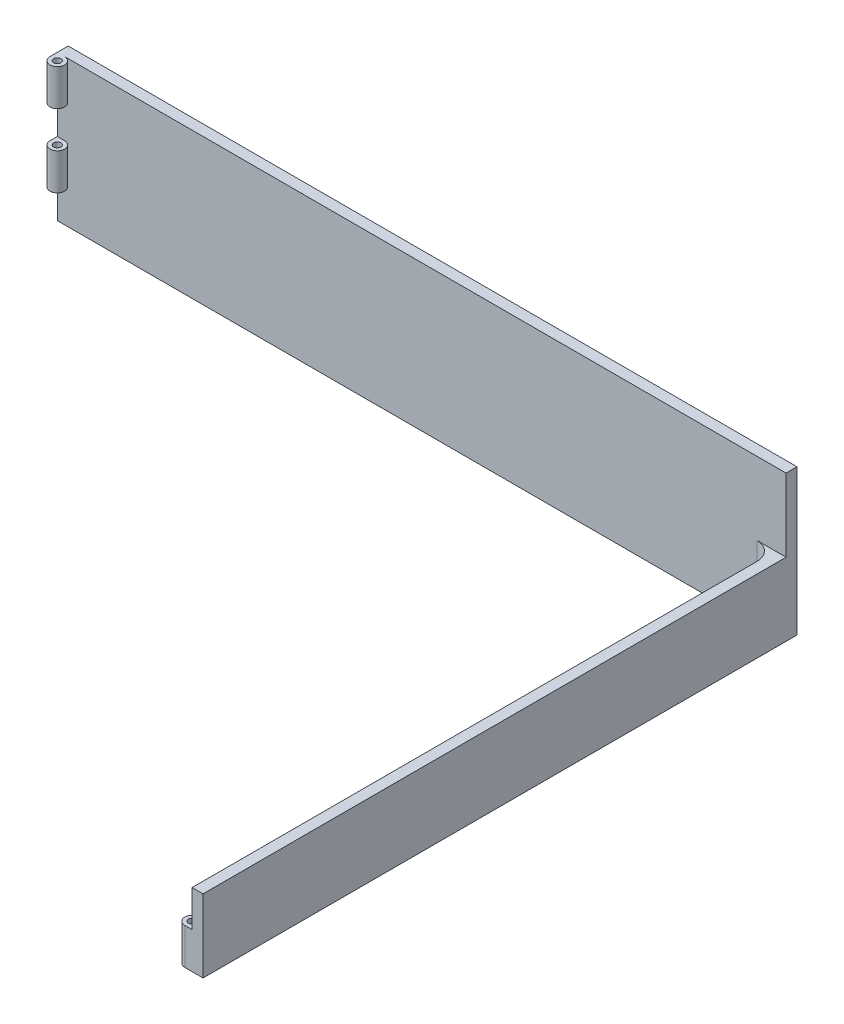
ISO-10303-21;
HEADER;
FILE_DESCRIPTION(('STEP AP214'),'2;1');
FILE_NAME('part.step','',(''),(''),'','','');
FILE_SCHEMA(('AUTOMOTIVE_DESIGN { 1 0 10303 214 1 1 1 1 }'));
ENDSEC;
DATA;
#1=APPLICATION_CONTEXT('core data for automotive mechanical design processes');
#2=APPLICATION_PROTOCOL_DEFINITION('international standard','automotive_design',2000,#1);
#3=PRODUCT_CONTEXT('',#1,'mechanical');
#4=PRODUCT('Part','Part','',(#3));
#5=PRODUCT_RELATED_PRODUCT_CATEGORY('part','',(#4));
#6=PRODUCT_DEFINITION_FORMATION('','',#4);
#7=PRODUCT_DEFINITION_CONTEXT('part definition',#1,'design');
#8=PRODUCT_DEFINITION('design','',#6,#7);
#9=PRODUCT_DEFINITION_SHAPE('','',#8);
#10=(LENGTH_UNIT() NAMED_UNIT(*) SI_UNIT(.MILLI.,.METRE.));
#11=(NAMED_UNIT(*) PLANE_ANGLE_UNIT() SI_UNIT($,.RADIAN.));
#12=(NAMED_UNIT(*) SI_UNIT($,.STERADIAN.) SOLID_ANGLE_UNIT());
#13=UNCERTAINTY_MEASURE_WITH_UNIT(LENGTH_MEASURE(1.E-05),#10,'distance_accuracy_value','');
#14=(GEOMETRIC_REPRESENTATION_CONTEXT(3) GLOBAL_UNCERTAINTY_ASSIGNED_CONTEXT((#13)) GLOBAL_UNIT_ASSIGNED_CONTEXT((#10,
#11,#12)) REPRESENTATION_CONTEXT('',''));
#15=CARTESIAN_POINT('',(0.,0.,0.));
#16=DIRECTION('',(0.,0.,1.));
#17=DIRECTION('',(1.,0.,0.));
#18=AXIS2_PLACEMENT_3D('',#15,#16,#17);
#19=CARTESIAN_POINT('',(43.594982078853,0.,0.));
#20=DIRECTION('',(1.,0.,0.));
#21=DIRECTION('',(0.,1.,0.));
#22=AXIS2_PLACEMENT_3D('',#19,#20,#21);
#23=PLANE('',#22);
#24=DIRECTION('',(0.,-1.,0.));
#25=VECTOR('',#24,1.);
#26=CARTESIAN_POINT('',(43.5949820788531,-23.5125448028674,161.));
#27=LINE('',#26,#25);
#28=CARTESIAN_POINT('',(43.5949820788531,-23.5125448028674,161.));
#29=VERTEX_POINT('',#28);
#30=CARTESIAN_POINT('',(43.5949820788531,-33.5125448028674,161.));
#31=VERTEX_POINT('',#30);
#32=EDGE_CURVE('E156',#29,#31,#27,.T.);
#33=ORIENTED_EDGE('',*,*,#32,.F.);
#34=DIRECTION('',(0.,0.,1.));
#35=VECTOR('',#34,1.);
#36=CARTESIAN_POINT('',(43.5949820788531,-23.5125448028674,163.));
#37=LINE('',#36,#35);
#38=CARTESIAN_POINT('',(43.5949820788531,-23.5125448028674,163.));
#39=VERTEX_POINT('',#38);
#40=EDGE_CURVE('E143',#29,#39,#37,.T.);
#41=ORIENTED_EDGE('',*,*,#40,.T.);
#42=DIRECTION('',(0.,-1.,0.));
#43=VECTOR('',#42,1.);
#44=CARTESIAN_POINT('',(43.594982078853,-13.5125448028674,163.));
#45=LINE('',#44,#43);
#46=CARTESIAN_POINT('',(43.594982078853,-13.5125448028674,163.));
#47=VERTEX_POINT('',#46);
#48=EDGE_CURVE('E154',#47,#39,#45,.T.);
#49=ORIENTED_EDGE('',*,*,#48,.F.);
#50=DIRECTION('',(0.,0.,1.));
#51=VECTOR('',#50,1.);
#52=CARTESIAN_POINT('',(43.594982078853,-13.5125448028674,3.));
#53=LINE('',#52,#51);
#54=CARTESIAN_POINT('',(43.594982078853,-13.5125448028674,8.));
#55=VERTEX_POINT('',#54);
#56=EDGE_CURVE('E163',#55,#47,#53,.T.);
#57=ORIENTED_EDGE('',*,*,#56,.F.);
#58=DIRECTION('',(0.,1.,0.));
#59=VECTOR('',#58,1.);
#60=CARTESIAN_POINT('',(43.594982078853,0.,8.));
#61=LINE('',#60,#59);
#62=CARTESIAN_POINT('',(43.5949820788531,-33.5125448028674,8.00000000000001));
#63=VERTEX_POINT('',#62);
#64=EDGE_CURVE('E217',#55,#63,#61,.F.);
#65=ORIENTED_EDGE('',*,*,#64,.T.);
#66=DIRECTION('',(0.,0.,-1.));
#67=VECTOR('',#66,1.);
#68=CARTESIAN_POINT('',(43.5949820788531,-33.5125448028674,163.));
#69=LINE('',#68,#67);
#70=EDGE_CURVE('E162',#31,#63,#69,.T.);
#71=ORIENTED_EDGE('',*,*,#70,.F.);
#72=EDGE_LOOP('',(#33,#41,#49,#57,#65,#71));
#73=FACE_BOUND('',#72,.T.);
#74=ADVANCED_FACE('F33',(#73),#23,.F.);
#75=CARTESIAN_POINT('',(0.,0.,3.));
#76=DIRECTION('',(0.,0.,1.));
#77=DIRECTION('',(1.,0.,0.));
#78=AXIS2_PLACEMENT_3D('',#75,#76,#77);
#79=PLANE('',#78);
#80=DIRECTION('',(0.,1.,0.));
#81=VECTOR('',#80,1.);
#82=CARTESIAN_POINT('',(-151.405017921147,-23.5125448028674,3.));
#83=LINE('',#82,#81);
#84=CARTESIAN_POINT('',(-151.405017921147,-23.5125448028674,3.));
#85=VERTEX_POINT('',#84);
#86=CARTESIAN_POINT('',(-151.405017921147,-13.5125448028674,3.));
#87=VERTEX_POINT('',#86);
#88=EDGE_CURVE('E56',#85,#87,#83,.T.);
#89=ORIENTED_EDGE('',*,*,#88,.F.);
#90=DIRECTION('',(-1.,0.,0.));
#91=VECTOR('',#90,1.);
#92=CARTESIAN_POINT('',(-153.405017921147,-23.5125448028674,3.));
#93=LINE('',#92,#91);
#94=CARTESIAN_POINT('',(-153.405017921147,-23.5125448028674,3.));
#95=VERTEX_POINT('',#94);
#96=EDGE_CURVE('E231',#85,#95,#93,.T.);
#97=ORIENTED_EDGE('',*,*,#96,.T.);
#98=DIRECTION('',(0.,-1.,0.));
#99=VECTOR('',#98,1.);
#100=CARTESIAN_POINT('',(-153.405017921147,6.48745519713262,3.));
#101=LINE('',#100,#99);
#102=CARTESIAN_POINT('',(-153.405017921147,-33.5125448028674,3.));
#103=VERTEX_POINT('',#102);
#104=EDGE_CURVE('E189',#95,#103,#101,.T.);
#105=ORIENTED_EDGE('',*,*,#104,.T.);
#106=DIRECTION('',(1.,0.,0.));
#107=VECTOR('',#106,1.);
#108=CARTESIAN_POINT('',(-153.405017921147,-33.5125448028674,3.));
#109=LINE('',#108,#107);
#110=CARTESIAN_POINT('',(38.5949820788531,-33.5125448028674,3.));
#111=VERTEX_POINT('',#110);
#112=EDGE_CURVE('E192',#103,#111,#109,.T.);
#113=ORIENTED_EDGE('',*,*,#112,.T.);
#114=DIRECTION('',(0.,1.,0.));
#115=VECTOR('',#114,1.);
#116=CARTESIAN_POINT('',(38.594982078853,0.,3.));
#117=LINE('',#116,#115);
#118=CARTESIAN_POINT('',(38.5949820788531,-13.5125448028674,3.));
#119=VERTEX_POINT('',#118);
#120=EDGE_CURVE('E214',#111,#119,#117,.T.);
#121=ORIENTED_EDGE('',*,*,#120,.T.);
#122=DIRECTION('',(1.,0.,0.));
#123=VECTOR('',#122,1.);
#124=CARTESIAN_POINT('',(43.594982078853,-13.5125448028674,3.));
#125=LINE('',#124,#123);
#126=CARTESIAN_POINT('',(46.5949820788531,-13.5125448028674,3.));
#127=VERTEX_POINT('',#126);
#128=EDGE_CURVE('E165',#119,#127,#125,.T.);
#129=ORIENTED_EDGE('',*,*,#128,.T.);
#130=DIRECTION('',(0.,1.,0.));
#131=VECTOR('',#130,1.);
#132=CARTESIAN_POINT('',(46.594982078853,6.48745519713262,3.));
#133=LINE('',#132,#131);
#134=CARTESIAN_POINT('',(46.594982078853,6.48745519713262,3.));
#135=VERTEX_POINT('',#134);
#136=EDGE_CURVE('E184',#127,#135,#133,.T.);
#137=ORIENTED_EDGE('',*,*,#136,.T.);
#138=DIRECTION('',(-1.,0.,0.));
#139=VECTOR('',#138,1.);
#140=CARTESIAN_POINT('',(-153.405017921147,6.48745519713262,3.));
#141=LINE('',#140,#139);
#142=CARTESIAN_POINT('',(-151.405017921147,6.48745519713262,3.));
#143=VERTEX_POINT('',#142);
#144=EDGE_CURVE('E186',#135,#143,#141,.T.);
#145=ORIENTED_EDGE('',*,*,#144,.T.);
#146=DIRECTION('',(0.,1.,0.));
#147=VECTOR('',#146,1.);
#148=CARTESIAN_POINT('',(-151.405017921147,-3.51254480286738,3.));
#149=LINE('',#148,#147);
#150=CARTESIAN_POINT('',(-151.405017921147,-3.51254480286738,3.));
#151=VERTEX_POINT('',#150);
#152=EDGE_CURVE('E174',#151,#143,#149,.T.);
#153=ORIENTED_EDGE('',*,*,#152,.F.);
#154=DIRECTION('',(-1.,0.,0.));
#155=VECTOR('',#154,1.);
#156=CARTESIAN_POINT('',(-153.405017921147,-3.51254480286738,3.));
#157=LINE('',#156,#155);
#158=CARTESIAN_POINT('',(-153.405017921147,-3.51254480286738,3.));
#159=VERTEX_POINT('',#158);
#160=EDGE_CURVE('E288',#151,#159,#157,.T.);
#161=ORIENTED_EDGE('',*,*,#160,.T.);
#162=CARTESIAN_POINT('',(-153.405017921147,-13.5125448028674,3.));
#163=VERTEX_POINT('',#162);
#164=EDGE_CURVE('E190',#159,#163,#101,.T.);
#165=ORIENTED_EDGE('',*,*,#164,.T.);
#166=DIRECTION('',(-1.,0.,0.));
#167=VECTOR('',#166,1.);
#168=CARTESIAN_POINT('',(-153.405017921147,-13.5125448028674,3.));
#169=LINE('',#168,#167);
#170=EDGE_CURVE('E261',#87,#163,#169,.T.);
#171=ORIENTED_EDGE('',*,*,#170,.F.);
#172=EDGE_LOOP('',(#89,#97,#105,#113,#121,#129,#137,#145,#153,#161,#165,#171));
#173=FACE_BOUND('',#172,.T.);
#174=ADVANCED_FACE('F229',(#173),#79,.T.);
#175=CARTESIAN_POINT('',(46.594982078853,6.48745519713262,3.));
#176=DIRECTION('',(-1.,0.,0.));
#177=DIRECTION('',(0.,-1.,0.));
#178=AXIS2_PLACEMENT_3D('',#175,#176,#177);
#179=PLANE('',#178);
#180=DIRECTION('',(0.,1.,0.));
#181=VECTOR('',#180,1.);
#182=CARTESIAN_POINT('',(46.594982078853,6.48745519713262,0.));
#183=LINE('',#182,#181);
#184=CARTESIAN_POINT('',(46.5949820788531,-33.5125448028674,0.));
#185=VERTEX_POINT('',#184);
#186=CARTESIAN_POINT('',(46.594982078853,6.48745519713262,0.));
#187=VERTEX_POINT('',#186);
#188=EDGE_CURVE('E180',#185,#187,#183,.T.);
#189=ORIENTED_EDGE('',*,*,#188,.T.);
#190=DIRECTION('',(0.,0.,-1.));
#191=VECTOR('',#190,1.);
#192=CARTESIAN_POINT('',(46.594982078853,6.48745519713262,3.));
#193=LINE('',#192,#191);
#194=EDGE_CURVE('E211',#135,#187,#193,.T.);
#195=ORIENTED_EDGE('',*,*,#194,.F.);
#196=ORIENTED_EDGE('',*,*,#136,.F.);
#197=DIRECTION('',(0.,0.,1.));
#198=VECTOR('',#197,1.);
#199=CARTESIAN_POINT('',(46.5949820788531,-13.5125448028674,3.));
#200=LINE('',#199,#198);
#201=CARTESIAN_POINT('',(46.5949820788531,-13.5125448028674,163.));
#202=VERTEX_POINT('',#201);
#203=EDGE_CURVE('E171',#127,#202,#200,.T.);
#204=ORIENTED_EDGE('',*,*,#203,.T.);
#205=DIRECTION('',(0.,-1.,0.));
#206=VECTOR('',#205,1.);
#207=CARTESIAN_POINT('',(46.5949820788531,-13.5125448028674,163.));
#208=LINE('',#207,#206);
#209=CARTESIAN_POINT('',(46.5949820788531,-33.5125448028674,163.));
#210=VERTEX_POINT('',#209);
#211=EDGE_CURVE('E167',#202,#210,#208,.T.);
#212=ORIENTED_EDGE('',*,*,#211,.T.);
#213=DIRECTION('',(0.,0.,-1.));
#214=VECTOR('',#213,1.);
#215=CARTESIAN_POINT('',(46.5949820788531,-33.5125448028674,3.));
#216=LINE('',#215,#214);
#217=EDGE_CURVE('E195',#210,#185,#216,.T.);
#218=ORIENTED_EDGE('',*,*,#217,.T.);
#219=EDGE_LOOP('',(#189,#195,#196,#204,#212,#218));
#220=FACE_BOUND('',#219,.T.);
#221=ADVANCED_FACE('F243',(#220),#179,.F.);
#222=CARTESIAN_POINT('',(-153.405017921147,6.48745519713262,3.));
#223=DIRECTION('',(0.,-1.,0.));
#224=DIRECTION('',(0.,0.,-1.));
#225=AXIS2_PLACEMENT_3D('',#222,#223,#224);
#226=PLANE('',#225);
#227=DIRECTION('',(-1.,0.,0.));
#228=VECTOR('',#227,1.);
#229=CARTESIAN_POINT('',(-153.405017921147,6.48745519713262,0.));
#230=LINE('',#229,#228);
#231=CARTESIAN_POINT('',(-153.405017921147,6.48745519713262,0.));
#232=VERTEX_POINT('',#231);
#233=EDGE_CURVE('E198',#187,#232,#230,.T.);
#234=ORIENTED_EDGE('',*,*,#233,.T.);
#235=DIRECTION('',(0.,0.,-1.));
#236=VECTOR('',#235,1.);
#237=CARTESIAN_POINT('',(-153.405017921147,6.48745519713262,3.));
#238=LINE('',#237,#236);
#239=CARTESIAN_POINT('',(-153.405017921147,6.48745519713262,5.));
#240=VERTEX_POINT('',#239);
#241=EDGE_CURVE('E208',#240,#232,#238,.T.);
#242=ORIENTED_EDGE('',*,*,#241,.F.);
#243=CARTESIAN_POINT('',(-151.405017921147,6.48745519713262,5.));
#244=DIRECTION('',(0.,1.,0.));
#245=DIRECTION('',(0.,0.,1.));
#246=AXIS2_PLACEMENT_3D('',#243,#244,#245);
#247=CIRCLE('',#246,2.);
#248=EDGE_CURVE('E285',#240,#143,#247,.T.);
#249=ORIENTED_EDGE('',*,*,#248,.T.);
#250=ORIENTED_EDGE('',*,*,#144,.F.);
#251=ORIENTED_EDGE('',*,*,#194,.T.);
#252=EDGE_LOOP('',(#234,#242,#249,#250,#251));
#253=FACE_BOUND('',#252,.T.);
#254=CARTESIAN_POINT('',(-151.405017921147,6.48745519713262,5.));
#255=DIRECTION('',(0.,1.,0.));
#256=DIRECTION('',(0.,0.,1.));
#257=AXIS2_PLACEMENT_3D('',#254,#255,#256);
#258=CIRCLE('',#257,0.999999999999998);
#259=CARTESIAN_POINT('',(-151.405017921147,6.48745519713262,6.));
#260=VERTEX_POINT('',#259);
#261=EDGE_CURVE('E280',#260,#260,#258,.T.);
#262=ORIENTED_EDGE('',*,*,#261,.F.);
#263=EDGE_LOOP('',(#262));
#264=FACE_BOUND('',#263,.T.);
#265=ADVANCED_FACE('F309',(#253,#264),#226,.F.);
#266=CARTESIAN_POINT('',(-153.405017921147,6.48745519713262,3.));
#267=DIRECTION('',(1.,0.,0.));
#268=DIRECTION('',(0.,0.,-1.));
#269=AXIS2_PLACEMENT_3D('',#266,#267,#268);
#270=PLANE('',#269);
#271=DIRECTION('',(0.,-1.,0.));
#272=VECTOR('',#271,1.);
#273=CARTESIAN_POINT('',(-153.405017921147,6.48745519713262,0.));
#274=LINE('',#273,#272);
#275=CARTESIAN_POINT('',(-153.405017921147,-33.5125448028674,0.));
#276=VERTEX_POINT('',#275);
#277=EDGE_CURVE('E200',#232,#276,#274,.T.);
#278=ORIENTED_EDGE('',*,*,#277,.T.);
#279=DIRECTION('',(0.,0.,-1.));
#280=VECTOR('',#279,1.);
#281=CARTESIAN_POINT('',(-153.405017921147,-33.5125448028674,3.));
#282=LINE('',#281,#280);
#283=EDGE_CURVE('E205',#103,#276,#282,.T.);
#284=ORIENTED_EDGE('',*,*,#283,.F.);
#285=ORIENTED_EDGE('',*,*,#104,.F.);
#286=DIRECTION('',(0.,0.,1.));
#287=VECTOR('',#286,1.);
#288=CARTESIAN_POINT('',(-153.405017921147,-23.5125448028674,3.));
#289=LINE('',#288,#287);
#290=CARTESIAN_POINT('',(-153.405017921147,-23.5125448028674,5.));
#291=VERTEX_POINT('',#290);
#292=EDGE_CURVE('E265',#95,#291,#289,.T.);
#293=ORIENTED_EDGE('',*,*,#292,.T.);
#294=DIRECTION('',(0.,1.,0.));
#295=VECTOR('',#294,1.);
#296=CARTESIAN_POINT('',(-153.405017921147,-23.5125448028674,5.));
#297=LINE('',#296,#295);
#298=CARTESIAN_POINT('',(-153.405017921147,-13.5125448028674,5.));
#299=VERTEX_POINT('',#298);
#300=EDGE_CURVE('E271',#291,#299,#297,.T.);
#301=ORIENTED_EDGE('',*,*,#300,.T.);
#302=DIRECTION('',(0.,0.,1.));
#303=VECTOR('',#302,1.);
#304=CARTESIAN_POINT('',(-153.405017921147,-13.5125448028674,3.));
#305=LINE('',#304,#303);
#306=EDGE_CURVE('E274',#163,#299,#305,.T.);
#307=ORIENTED_EDGE('',*,*,#306,.F.);
#308=ORIENTED_EDGE('',*,*,#164,.F.);
#309=DIRECTION('',(0.,0.,1.));
#310=VECTOR('',#309,1.);
#311=CARTESIAN_POINT('',(-153.405017921147,-3.51254480286738,3.));
#312=LINE('',#311,#310);
#313=CARTESIAN_POINT('',(-153.405017921147,-3.51254480286738,5.));
#314=VERTEX_POINT('',#313);
#315=EDGE_CURVE('E291',#159,#314,#312,.T.);
#316=ORIENTED_EDGE('',*,*,#315,.T.);
#317=DIRECTION('',(0.,1.,0.));
#318=VECTOR('',#317,1.);
#319=CARTESIAN_POINT('',(-153.405017921147,-3.51254480286738,5.));
#320=LINE('',#319,#318);
#321=EDGE_CURVE('E297',#314,#240,#320,.T.);
#322=ORIENTED_EDGE('',*,*,#321,.T.);
#323=ORIENTED_EDGE('',*,*,#241,.T.);
#324=EDGE_LOOP('',(#278,#284,#285,#293,#301,#307,#308,#316,#322,#323));
#325=FACE_BOUND('',#324,.T.);
#326=ADVANCED_FACE('F235',(#325),#270,.F.);
#327=CARTESIAN_POINT('',(-153.405017921147,-33.5125448028674,3.));
#328=DIRECTION('',(0.,1.,0.));
#329=DIRECTION('',(0.,0.,1.));
#330=AXIS2_PLACEMENT_3D('',#327,#328,#329);
#331=PLANE('',#330);
#332=DIRECTION('',(1.,0.,0.));
#333=VECTOR('',#332,1.);
#334=CARTESIAN_POINT('',(-153.405017921147,-33.5125448028674,0.));
#335=LINE('',#334,#333);
#336=EDGE_CURVE('E187',#276,#185,#335,.T.);
#337=ORIENTED_EDGE('',*,*,#336,.T.);
#338=ORIENTED_EDGE('',*,*,#217,.F.);
#339=DIRECTION('',(1.,0.,0.));
#340=VECTOR('',#339,1.);
#341=CARTESIAN_POINT('',(43.5949820788531,-33.5125448028674,163.));
#342=LINE('',#341,#340);
#343=CARTESIAN_POINT('',(41.5949820788531,-33.5125448028674,163.));
#344=VERTEX_POINT('',#343);
#345=EDGE_CURVE('E177',#344,#210,#342,.T.);
#346=ORIENTED_EDGE('',*,*,#345,.F.);
#347=CARTESIAN_POINT('',(41.5949820788531,-33.5125448028674,161.));
#348=DIRECTION('',(0.,-1.,0.));
#349=DIRECTION('',(0.,0.,1.));
#350=AXIS2_PLACEMENT_3D('',#347,#348,#349);
#351=CIRCLE('',#350,2.);
#352=EDGE_CURVE('E48',#344,#31,#351,.T.);
#353=ORIENTED_EDGE('',*,*,#352,.T.);
#354=ORIENTED_EDGE('',*,*,#70,.T.);
#355=CARTESIAN_POINT('',(38.5949820788531,-33.5125448028674,8.));
#356=DIRECTION('',(0.,1.,0.));
#357=DIRECTION('',(0.,0.,1.));
#358=AXIS2_PLACEMENT_3D('',#355,#356,#357);
#359=CIRCLE('',#358,5.);
#360=EDGE_CURVE('E11',#63,#111,#359,.T.);
#361=ORIENTED_EDGE('',*,*,#360,.T.);
#362=ORIENTED_EDGE('',*,*,#112,.F.);
#363=ORIENTED_EDGE('',*,*,#283,.T.);
#364=EDGE_LOOP('',(#337,#338,#346,#353,#354,#361,#362,#363));
#365=FACE_BOUND('',#364,.T.);
#366=CARTESIAN_POINT('',(41.5949820788531,-33.5125448028674,161.));
#367=DIRECTION('',(0.,-1.,0.));
#368=DIRECTION('',(0.,0.,-1.));
#369=AXIS2_PLACEMENT_3D('',#366,#367,#368);
#370=CIRCLE('',#369,0.999999999999998);
#371=CARTESIAN_POINT('',(41.5949820788531,-33.5125448028674,160.));
#372=VERTEX_POINT('',#371);
#373=EDGE_CURVE('E252',#372,#372,#370,.T.);
#374=ORIENTED_EDGE('',*,*,#373,.F.);
#375=EDGE_LOOP('',(#374));
#376=FACE_BOUND('',#375,.T.);
#377=ADVANCED_FACE('F227',(#365,#376),#331,.F.);
#378=CARTESIAN_POINT('',(0.,0.,0.));
#379=DIRECTION('',(0.,0.,1.));
#380=DIRECTION('',(1.,0.,0.));
#381=AXIS2_PLACEMENT_3D('',#378,#379,#380);
#382=PLANE('',#381);
#383=ORIENTED_EDGE('',*,*,#188,.F.);
#384=ORIENTED_EDGE('',*,*,#336,.F.);
#385=ORIENTED_EDGE('',*,*,#277,.F.);
#386=ORIENTED_EDGE('',*,*,#233,.F.);
#387=EDGE_LOOP('',(#383,#384,#385,#386));
#388=FACE_BOUND('',#387,.T.);
#389=ADVANCED_FACE('F240',(#388),#382,.F.);
#390=CARTESIAN_POINT('',(43.594982078853,-13.5125448028674,163.));
#391=DIRECTION('',(0.,0.,1.));
#392=DIRECTION('',(1.,0.,0.));
#393=AXIS2_PLACEMENT_3D('',#390,#391,#392);
#394=PLANE('',#393);
#395=ORIENTED_EDGE('',*,*,#211,.F.);
#396=DIRECTION('',(1.,0.,0.));
#397=VECTOR('',#396,1.);
#398=CARTESIAN_POINT('',(43.594982078853,-13.5125448028674,163.));
#399=LINE('',#398,#397);
#400=EDGE_CURVE('E161',#47,#202,#399,.T.);
#401=ORIENTED_EDGE('',*,*,#400,.F.);
#402=ORIENTED_EDGE('',*,*,#48,.T.);
#403=DIRECTION('',(-1.,0.,0.));
#404=VECTOR('',#403,1.);
#405=CARTESIAN_POINT('',(43.5949820788531,-23.5125448028674,163.));
#406=LINE('',#405,#404);
#407=CARTESIAN_POINT('',(41.5949820788531,-23.5125448028674,163.));
#408=VERTEX_POINT('',#407);
#409=EDGE_CURVE('E140',#39,#408,#406,.T.);
#410=ORIENTED_EDGE('',*,*,#409,.T.);
#411=DIRECTION('',(0.,-1.,0.));
#412=VECTOR('',#411,1.);
#413=CARTESIAN_POINT('',(41.5949820788531,-23.5125448028674,163.));
#414=LINE('',#413,#412);
#415=EDGE_CURVE('E245',#408,#344,#414,.T.);
#416=ORIENTED_EDGE('',*,*,#415,.T.);
#417=ORIENTED_EDGE('',*,*,#345,.T.);
#418=EDGE_LOOP('',(#395,#401,#402,#410,#416,#417));
#419=FACE_BOUND('',#418,.T.);
#420=ADVANCED_FACE('F160',(#419),#394,.T.);
#421=CARTESIAN_POINT('',(43.594982078853,-13.5125448028674,3.));
#422=DIRECTION('',(0.,1.,0.));
#423=DIRECTION('',(-1.,0.,0.));
#424=AXIS2_PLACEMENT_3D('',#421,#422,#423);
#425=PLANE('',#424);
#426=ORIENTED_EDGE('',*,*,#203,.F.);
#427=ORIENTED_EDGE('',*,*,#128,.F.);
#428=CARTESIAN_POINT('',(38.5949820788531,-13.5125448028674,8.));
#429=DIRECTION('',(0.,1.,0.));
#430=DIRECTION('',(-1.,0.,0.));
#431=AXIS2_PLACEMENT_3D('',#428,#429,#430);
#432=CIRCLE('',#431,5.);
#433=EDGE_CURVE('E41',#119,#55,#432,.F.);
#434=ORIENTED_EDGE('',*,*,#433,.T.);
#435=ORIENTED_EDGE('',*,*,#56,.T.);
#436=ORIENTED_EDGE('',*,*,#400,.T.);
#437=EDGE_LOOP('',(#426,#427,#434,#435,#436));
#438=FACE_BOUND('',#437,.T.);
#439=ADVANCED_FACE('F221',(#438),#425,.T.);
#440=CARTESIAN_POINT('',(38.594982078853,0.,8.));
#441=DIRECTION('',(0.,1.,0.));
#442=DIRECTION('',(-1.,0.,0.));
#443=AXIS2_PLACEMENT_3D('',#440,#441,#442);
#444=CYLINDRICAL_SURFACE('',#443,5.);
#445=ORIENTED_EDGE('',*,*,#360,.F.);
#446=ORIENTED_EDGE('',*,*,#64,.F.);
#447=ORIENTED_EDGE('',*,*,#433,.F.);
#448=ORIENTED_EDGE('',*,*,#120,.F.);
#449=EDGE_LOOP('',(#445,#446,#447,#448));
#450=FACE_BOUND('',#449,.T.);
#451=ADVANCED_FACE('F35',(#450),#444,.F.);
#452=CARTESIAN_POINT('',(-151.405017921147,-3.51254480286738,5.));
#453=DIRECTION('',(0.,1.,0.));
#454=DIRECTION('',(0.,0.,1.));
#455=AXIS2_PLACEMENT_3D('',#452,#453,#454);
#456=CYLINDRICAL_SURFACE('',#455,2.);
#457=ORIENTED_EDGE('',*,*,#248,.F.);
#458=ORIENTED_EDGE('',*,*,#321,.F.);
#459=CARTESIAN_POINT('',(-151.405017921147,-3.51254480286738,5.));
#460=DIRECTION('',(0.,1.,0.));
#461=DIRECTION('',(0.,0.,1.));
#462=AXIS2_PLACEMENT_3D('',#459,#460,#461);
#463=CIRCLE('',#462,2.);
#464=EDGE_CURVE('E294',#314,#151,#463,.T.);
#465=ORIENTED_EDGE('',*,*,#464,.T.);
#466=ORIENTED_EDGE('',*,*,#152,.T.);
#467=EDGE_LOOP('',(#457,#458,#465,#466));
#468=FACE_BOUND('',#467,.T.);
#469=ADVANCED_FACE('F306',(#468),#456,.T.);
#470=CARTESIAN_POINT('',(-151.405017921147,-3.51254480286738,5.));
#471=DIRECTION('',(0.,1.,0.));
#472=DIRECTION('',(0.,0.,1.));
#473=AXIS2_PLACEMENT_3D('',#470,#471,#472);
#474=PLANE('',#473);
#475=CARTESIAN_POINT('',(-151.405017921147,-3.51254480286738,5.));
#476=DIRECTION('',(0.,1.,0.));
#477=DIRECTION('',(0.,0.,1.));
#478=AXIS2_PLACEMENT_3D('',#475,#476,#477);
#479=CIRCLE('',#478,0.999999999999998);
#480=CARTESIAN_POINT('',(-151.405017921147,-3.51254480286738,6.));
#481=VERTEX_POINT('',#480);
#482=EDGE_CURVE('E282',#481,#481,#479,.T.);
#483=ORIENTED_EDGE('',*,*,#482,.T.);
#484=EDGE_LOOP('',(#483));
#485=FACE_BOUND('',#484,.T.);
#486=ORIENTED_EDGE('',*,*,#160,.F.);
#487=ORIENTED_EDGE('',*,*,#464,.F.);
#488=ORIENTED_EDGE('',*,*,#315,.F.);
#489=EDGE_LOOP('',(#486,#487,#488));
#490=FACE_BOUND('',#489,.T.);
#491=ADVANCED_FACE('F313',(#485,#490),#474,.F.);
#492=CARTESIAN_POINT('',(-151.405017921147,-3.51254480286738,5.));
#493=DIRECTION('',(0.,1.,0.));
#494=DIRECTION('',(0.,0.,1.));
#495=AXIS2_PLACEMENT_3D('',#492,#493,#494);
#496=CYLINDRICAL_SURFACE('',#495,0.999999999999998);
#497=ORIENTED_EDGE('',*,*,#482,.F.);
#498=EDGE_LOOP('',(#497));
#499=FACE_BOUND('',#498,.T.);
#500=ORIENTED_EDGE('',*,*,#261,.T.);
#501=EDGE_LOOP('',(#500));
#502=FACE_BOUND('',#501,.T.);
#503=ADVANCED_FACE('F315',(#499,#502),#496,.F.);
#504=CARTESIAN_POINT('',(-151.405017921147,-23.5125448028674,5.));
#505=DIRECTION('',(0.,1.,0.));
#506=DIRECTION('',(0.,0.,1.));
#507=AXIS2_PLACEMENT_3D('',#504,#505,#506);
#508=CYLINDRICAL_SURFACE('',#507,2.);
#509=CARTESIAN_POINT('',(-151.405017921147,-13.5125448028674,5.));
#510=DIRECTION('',(0.,1.,0.));
#511=DIRECTION('',(0.,0.,1.));
#512=AXIS2_PLACEMENT_3D('',#509,#510,#511);
#513=CIRCLE('',#512,2.);
#514=EDGE_CURVE('E266',#299,#87,#513,.T.);
#515=ORIENTED_EDGE('',*,*,#514,.F.);
#516=ORIENTED_EDGE('',*,*,#300,.F.);
#517=CARTESIAN_POINT('',(-151.405017921147,-23.5125448028674,5.));
#518=DIRECTION('',(0.,1.,0.));
#519=DIRECTION('',(0.,0.,1.));
#520=AXIS2_PLACEMENT_3D('',#517,#518,#519);
#521=CIRCLE('',#520,2.);
#522=EDGE_CURVE('E268',#291,#85,#521,.T.);
#523=ORIENTED_EDGE('',*,*,#522,.T.);
#524=ORIENTED_EDGE('',*,*,#88,.T.);
#525=EDGE_LOOP('',(#515,#516,#523,#524));
#526=FACE_BOUND('',#525,.T.);
#527=ADVANCED_FACE('F322',(#526),#508,.T.);
#528=CARTESIAN_POINT('',(-151.405017921147,-23.5125448028674,5.));
#529=DIRECTION('',(0.,1.,0.));
#530=DIRECTION('',(0.,0.,1.));
#531=AXIS2_PLACEMENT_3D('',#528,#529,#530);
#532=PLANE('',#531);
#533=CARTESIAN_POINT('',(-151.405017921147,-23.5125448028674,5.));
#534=DIRECTION('',(0.,1.,0.));
#535=DIRECTION('',(0.,0.,1.));
#536=AXIS2_PLACEMENT_3D('',#533,#534,#535);
#537=CIRCLE('',#536,0.999999999999998);
#538=CARTESIAN_POINT('',(-151.405017921147,-23.5125448028674,6.));
#539=VERTEX_POINT('',#538);
#540=EDGE_CURVE('E258',#539,#539,#537,.T.);
#541=ORIENTED_EDGE('',*,*,#540,.T.);
#542=EDGE_LOOP('',(#541));
#543=FACE_BOUND('',#542,.T.);
#544=ORIENTED_EDGE('',*,*,#96,.F.);
#545=ORIENTED_EDGE('',*,*,#522,.F.);
#546=ORIENTED_EDGE('',*,*,#292,.F.);
#547=EDGE_LOOP('',(#544,#545,#546));
#548=FACE_BOUND('',#547,.T.);
#549=ADVANCED_FACE('F406',(#543,#548),#532,.F.);
#550=CARTESIAN_POINT('',(-151.405017921147,-13.5125448028674,5.));
#551=DIRECTION('',(0.,1.,0.));
#552=DIRECTION('',(0.,0.,1.));
#553=AXIS2_PLACEMENT_3D('',#550,#551,#552);
#554=PLANE('',#553);
#555=CARTESIAN_POINT('',(-151.405017921147,-13.5125448028674,5.));
#556=DIRECTION('',(0.,1.,0.));
#557=DIRECTION('',(0.,0.,1.));
#558=AXIS2_PLACEMENT_3D('',#555,#556,#557);
#559=CIRCLE('',#558,0.999999999999998);
#560=CARTESIAN_POINT('',(-151.405017921147,-13.5125448028674,6.));
#561=VERTEX_POINT('',#560);
#562=EDGE_CURVE('E256',#561,#561,#559,.T.);
#563=ORIENTED_EDGE('',*,*,#562,.F.);
#564=EDGE_LOOP('',(#563));
#565=FACE_BOUND('',#564,.T.);
#566=ORIENTED_EDGE('',*,*,#170,.T.);
#567=ORIENTED_EDGE('',*,*,#306,.T.);
#568=ORIENTED_EDGE('',*,*,#514,.T.);
#569=EDGE_LOOP('',(#566,#567,#568));
#570=FACE_BOUND('',#569,.T.);
#571=ADVANCED_FACE('F415',(#565,#570),#554,.T.);
#572=CARTESIAN_POINT('',(-151.405017921147,-23.5125448028674,5.));
#573=DIRECTION('',(0.,1.,0.));
#574=DIRECTION('',(0.,0.,1.));
#575=AXIS2_PLACEMENT_3D('',#572,#573,#574);
#576=CYLINDRICAL_SURFACE('',#575,0.999999999999998);
#577=ORIENTED_EDGE('',*,*,#540,.F.);
#578=EDGE_LOOP('',(#577));
#579=FACE_BOUND('',#578,.T.);
#580=ORIENTED_EDGE('',*,*,#562,.T.);
#581=EDGE_LOOP('',(#580));
#582=FACE_BOUND('',#581,.T.);
#583=ADVANCED_FACE('F424',(#579,#582),#576,.F.);
#584=CARTESIAN_POINT('',(41.5949820788531,-23.5125448028674,161.));
#585=DIRECTION('',(0.,-1.,0.));
#586=DIRECTION('',(0.,0.,-1.));
#587=AXIS2_PLACEMENT_3D('',#584,#585,#586);
#588=CYLINDRICAL_SURFACE('',#587,2.);
#589=ORIENTED_EDGE('',*,*,#352,.F.);
#590=ORIENTED_EDGE('',*,*,#415,.F.);
#591=CARTESIAN_POINT('',(41.5949820788531,-23.5125448028674,161.));
#592=DIRECTION('',(0.,-1.,0.));
#593=DIRECTION('',(0.,0.,1.));
#594=AXIS2_PLACEMENT_3D('',#591,#592,#593);
#595=CIRCLE('',#594,2.);
#596=EDGE_CURVE('E145',#408,#29,#595,.T.);
#597=ORIENTED_EDGE('',*,*,#596,.T.);
#598=ORIENTED_EDGE('',*,*,#32,.T.);
#599=EDGE_LOOP('',(#589,#590,#597,#598));
#600=FACE_BOUND('',#599,.T.);
#601=ADVANCED_FACE('F248',(#600),#588,.T.);
#602=CARTESIAN_POINT('',(41.5949820788531,-23.5125448028674,161.));
#603=DIRECTION('',(0.,1.,0.));
#604=DIRECTION('',(0.,0.,1.));
#605=AXIS2_PLACEMENT_3D('',#602,#603,#604);
#606=PLANE('',#605);
#607=CARTESIAN_POINT('',(41.5949820788531,-23.5125448028674,161.));
#608=DIRECTION('',(0.,-1.,0.));
#609=DIRECTION('',(0.,0.,-1.));
#610=AXIS2_PLACEMENT_3D('',#607,#608,#609);
#611=CIRCLE('',#610,0.999999999999998);
#612=CARTESIAN_POINT('',(41.5949820788531,-23.5125448028674,160.));
#613=VERTEX_POINT('',#612);
#614=EDGE_CURVE('E249',#613,#613,#611,.T.);
#615=ORIENTED_EDGE('',*,*,#614,.T.);
#616=EDGE_LOOP('',(#615));
#617=FACE_BOUND('',#616,.T.);
#618=ORIENTED_EDGE('',*,*,#40,.F.);
#619=ORIENTED_EDGE('',*,*,#596,.F.);
#620=ORIENTED_EDGE('',*,*,#409,.F.);
#621=EDGE_LOOP('',(#618,#619,#620));
#622=FACE_BOUND('',#621,.T.);
#623=ADVANCED_FACE('F142',(#617,#622),#606,.T.);
#624=CARTESIAN_POINT('',(41.5949820788531,-23.5125448028674,161.));
#625=DIRECTION('',(0.,-1.,0.));
#626=DIRECTION('',(0.,0.,-1.));
#627=AXIS2_PLACEMENT_3D('',#624,#625,#626);
#628=CYLINDRICAL_SURFACE('',#627,0.999999999999998);
#629=ORIENTED_EDGE('',*,*,#614,.F.);
#630=EDGE_LOOP('',(#629));
#631=FACE_BOUND('',#630,.T.);
#632=ORIENTED_EDGE('',*,*,#373,.T.);
#633=EDGE_LOOP('',(#632));
#634=FACE_BOUND('',#633,.T.);
#635=ADVANCED_FACE('F467',(#631,#634),#628,.F.);
#636=CLOSED_SHELL('',(#74,#174,#221,#265,#326,#377,#389,#420,#439,#451,#469,#491,#503,#527,#549,
#571,#583,#601,#623,#635));
#637=MANIFOLD_SOLID_BREP('B2',#636);
#638=ADVANCED_BREP_SHAPE_REPRESENTATION('',(#18,#637),#14);
#639=SHAPE_DEFINITION_REPRESENTATION(#9,#638);
ENDSEC;
END-ISO-10303-21;
